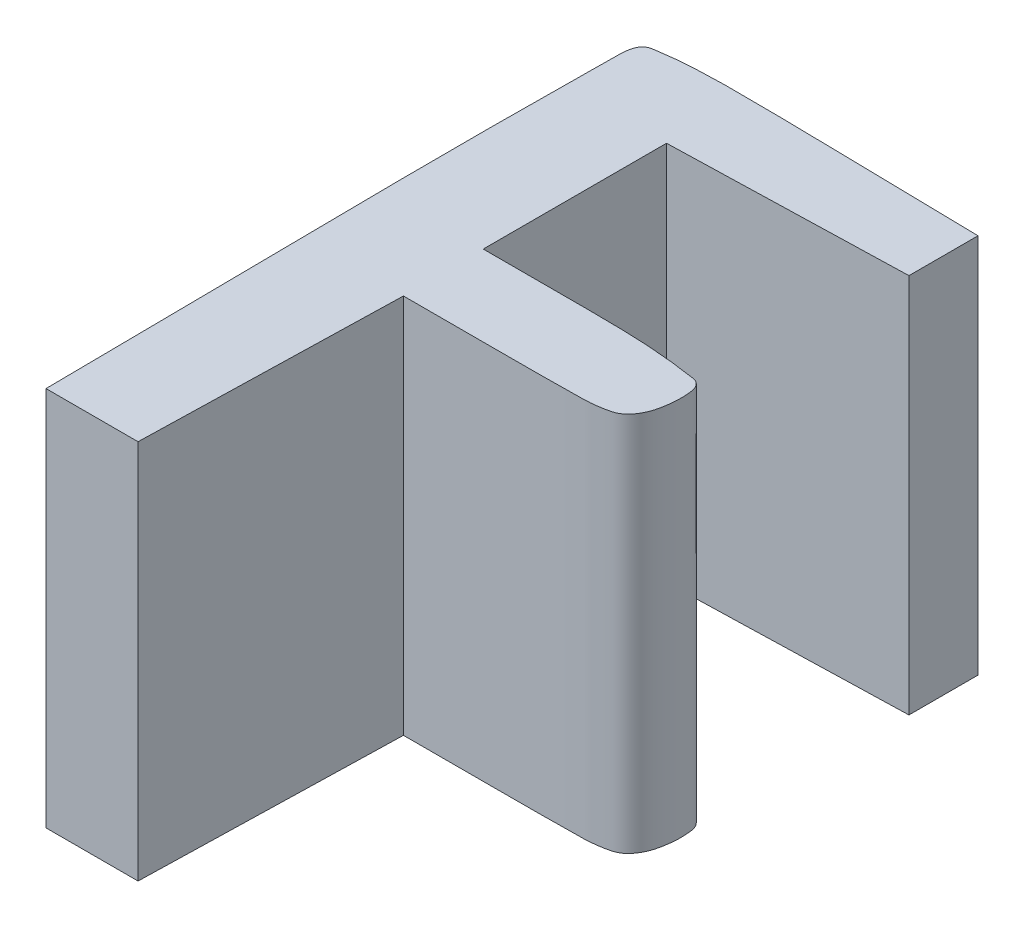
ISO-10303-21;
HEADER;
FILE_DESCRIPTION(('STEP AP214'),'2;1');
FILE_NAME('part.step','',(''),(''),'','','');
FILE_SCHEMA(('AUTOMOTIVE_DESIGN { 1 0 10303 214 1 1 1 1 }'));
ENDSEC;
DATA;
#1=APPLICATION_CONTEXT('core data for automotive mechanical design processes');
#2=APPLICATION_PROTOCOL_DEFINITION('international standard','automotive_design',2000,#1);
#3=PRODUCT_CONTEXT('',#1,'mechanical');
#4=PRODUCT('Part','Part','',(#3));
#5=PRODUCT_RELATED_PRODUCT_CATEGORY('part','',(#4));
#6=PRODUCT_DEFINITION_FORMATION('','',#4);
#7=PRODUCT_DEFINITION_CONTEXT('part definition',#1,'design');
#8=PRODUCT_DEFINITION('design','',#6,#7);
#9=PRODUCT_DEFINITION_SHAPE('','',#8);
#10=(LENGTH_UNIT() NAMED_UNIT(*) SI_UNIT(.MILLI.,.METRE.));
#11=(NAMED_UNIT(*) PLANE_ANGLE_UNIT() SI_UNIT($,.RADIAN.));
#12=(NAMED_UNIT(*) SI_UNIT($,.STERADIAN.) SOLID_ANGLE_UNIT());
#13=UNCERTAINTY_MEASURE_WITH_UNIT(LENGTH_MEASURE(1.E-05),#10,'distance_accuracy_value','');
#14=(GEOMETRIC_REPRESENTATION_CONTEXT(3) GLOBAL_UNCERTAINTY_ASSIGNED_CONTEXT((#13)) GLOBAL_UNIT_ASSIGNED_CONTEXT((#10,
#11,#12)) REPRESENTATION_CONTEXT('',''));
#15=CARTESIAN_POINT('',(0.,0.,0.));
#16=DIRECTION('',(0.,0.,1.));
#17=DIRECTION('',(1.,0.,0.));
#18=AXIS2_PLACEMENT_3D('',#15,#16,#17);
#19=CARTESIAN_POINT('',(51.373291634617,66.7433443998356,55.3705816043237));
#20=DIRECTION('',(0.,1.,0.));
#21=DIRECTION('',(1.,0.,0.));
#22=AXIS2_PLACEMENT_3D('',#19,#20,#21);
#23=PLANE('',#22);
#24=CARTESIAN_POINT('',(51.3971717335317,66.7433443998356,54.6579344724633));
#25=CARTESIAN_POINT('',(51.3971717335317,66.7433443998356,54.6911984724635));
#26=CARTESIAN_POINT('',(51.3971717335317,66.7433443998356,54.7244624724638));
#27=CARTESIAN_POINT('',(51.3971717335317,66.7433443998356,54.7577264724641));
#28=(BOUNDED_CURVE() B_SPLINE_CURVE(3,(#24,#25,#26,#27),.UNSPECIFIED.,.F.,
.F.) B_SPLINE_CURVE_WITH_KNOTS((4,4),(0.,1.),
.UNSPECIFIED.) CURVE() GEOMETRIC_REPRESENTATION_ITEM() RATIONAL_B_SPLINE_CURVE((1.,1.,1.,1.)) REPRESENTATION_ITEM(''));
#29=CARTESIAN_POINT('',(51.3971717335317,66.7433443998356,54.6579344724633));
#30=VERTEX_POINT('',#29);
#31=CARTESIAN_POINT('',(51.3971717335317,66.7433443998356,54.7577264724641));
#32=VERTEX_POINT('',#31);
#33=EDGE_CURVE('E11',#30,#32,#28,.T.);
#34=ORIENTED_EDGE('',*,*,#33,.T.);
#35=CARTESIAN_POINT('',(51.3971717335317,66.7433443998356,54.7577264724641));
#36=CARTESIAN_POINT('',(51.2835197335317,66.7433443998356,54.7608863639676));
#37=CARTESIAN_POINT('',(51.1698677335317,66.7433443998356,54.7640462554712));
#38=CARTESIAN_POINT('',(50.9425637335317,66.7433443998356,54.7703660384783));
#39=CARTESIAN_POINT('',(50.8289117335316,66.7433443998356,54.7735259299832));
#40=CARTESIAN_POINT('',(50.7152597335316,66.7433443998356,54.7766858214872));
#41=(BOUNDED_CURVE() B_SPLINE_CURVE(3,(#35,#36,#37,#38,#39,#40),.UNSPECIFIED.,.F.,
.F.) B_SPLINE_CURVE_WITH_KNOTS((4,2,4),(0.,0.5,1.),
.UNSPECIFIED.) CURVE() GEOMETRIC_REPRESENTATION_ITEM() RATIONAL_B_SPLINE_CURVE((1.,1.,1.,1.,1.,1.)) REPRESENTATION_ITEM(''));
#42=CARTESIAN_POINT('',(50.7152597335316,66.7433443998356,54.7766858214872));
#43=VERTEX_POINT('',#42);
#44=EDGE_CURVE('E196',#32,#43,#41,.T.);
#45=ORIENTED_EDGE('',*,*,#44,.T.);
#46=CARTESIAN_POINT('',(50.7152597335316,66.7433443998356,54.7766858214872));
#47=CARTESIAN_POINT('',(50.7152597335316,66.7433443998356,54.8650019299832));
#48=CARTESIAN_POINT('',(50.7152597335316,66.7433443998356,54.9533180384793));
#49=CARTESIAN_POINT('',(50.7152597335316,66.7433443998356,55.1299502554713));
#50=CARTESIAN_POINT('',(50.7152597335316,66.7433443998356,55.2182663639675));
#51=CARTESIAN_POINT('',(50.7152597335316,66.7433443998356,55.3065824724636));
#52=(BOUNDED_CURVE() B_SPLINE_CURVE(3,(#46,#47,#48,#49,#50,#51),.UNSPECIFIED.,.F.,
.F.) B_SPLINE_CURVE_WITH_KNOTS((4,2,4),(0.,0.5,1.),
.UNSPECIFIED.) CURVE() GEOMETRIC_REPRESENTATION_ITEM() RATIONAL_B_SPLINE_CURVE((1.,1.,1.,1.,1.,1.)) REPRESENTATION_ITEM(''));
#53=CARTESIAN_POINT('',(50.7152597335316,66.7433443998356,55.3065824724636));
#54=VERTEX_POINT('',#53);
#55=EDGE_CURVE('E217',#43,#54,#52,.T.);
#56=ORIENTED_EDGE('',*,*,#55,.T.);
#57=CARTESIAN_POINT('',(50.7152597335316,66.7433443998356,55.3065824724636));
#58=CARTESIAN_POINT('',(50.8199413530359,66.7433443998356,55.3065824724636));
#59=CARTESIAN_POINT('',(50.9246229725397,66.7433443998356,55.3065824724636));
#60=CARTESIAN_POINT('',(51.0293045920445,66.7433443998356,55.3065824724636));
#61=CARTESIAN_POINT('',(51.071874210531,66.7433443998355,55.3065824724631));
#62=CARTESIAN_POINT('',(51.1144363752432,66.7433443998355,55.3073790711196));
#63=CARTESIAN_POINT('',(51.1569761816284,66.7433443998356,55.3089719586388));
#64=CARTESIAN_POINT('',(51.1919522870094,66.7433443998355,55.3102816261352));
#65=CARTESIAN_POINT('',(51.2268650375715,66.7433443998355,55.3127601461486));
#66=CARTESIAN_POINT('',(51.2616753867008,66.7433443998356,55.3164046996459));
#67=CARTESIAN_POINT('',(51.2888790146875,66.7433443998356,55.3192528491184));
#68=CARTESIAN_POINT('',(51.3159992394937,66.7433443998356,55.3228085178742));
#69=CARTESIAN_POINT('',(51.3430176754193,66.7433443998356,55.3270692045752));
#70=CARTESIAN_POINT('',(51.3523045680939,66.7433443998355,55.3285337060818));
#71=CARTESIAN_POINT('',(51.3601334096972,66.7433443998355,55.3337395127712));
#72=CARTESIAN_POINT('',(51.365076164797,66.7433443998356,55.341737031902));
#73=CARTESIAN_POINT('',(51.3686822379329,66.7433443998357,55.3475717613819));
#74=CARTESIAN_POINT('',(51.371040641636,66.7433443998357,55.3540127080559));
#75=CARTESIAN_POINT('',(51.3720549519967,66.7433443998356,55.3607964390394));
#76=CARTESIAN_POINT('',(51.3735230221042,66.7433443998356,55.3706149256329));
#77=CARTESIAN_POINT('',(51.3743156046407,66.7433443998356,55.3805108700789));
#78=CARTESIAN_POINT('',(51.3744289704119,66.7433443998356,55.390437856382));
#79=CARTESIAN_POINT('',(51.3745588689021,66.7433443998356,55.4018125466901));
#80=CARTESIAN_POINT('',(51.3739514133887,66.7433443998356,55.4131717501605));
#81=CARTESIAN_POINT('',(51.3726092632913,66.7433443998356,55.4244677267196));
#82=CARTESIAN_POINT('',(51.371260036689,66.7433443998356,55.4358232614782));
#83=CARTESIAN_POINT('',(51.3691893158798,66.7433443998356,55.4470696258412));
#84=CARTESIAN_POINT('',(51.3664055605567,66.7433443998356,55.4581610319037));
#85=CARTESIAN_POINT('',(51.36213651395,66.7433443998355,55.4751703319016));
#86=CARTESIAN_POINT('',(51.3543697520201,66.7433443998355,55.490893512504));
#87=CARTESIAN_POINT('',(51.3434559951478,66.7433443998356,55.5046205280651));
#88=CARTESIAN_POINT('',(51.3339429085179,66.7433443998355,55.5165858201013));
#89=CARTESIAN_POINT('',(51.3210622987298,66.7433443998355,55.5248172858482));
#90=CARTESIAN_POINT('',(51.3062077995474,66.7433443998356,55.5284243462556));
#91=CARTESIAN_POINT('',(51.2822652175274,66.7433443998356,55.5342382305606));
#92=CARTESIAN_POINT('',(51.2578263407489,66.7433443998356,55.5373671074396));
#93=CARTESIAN_POINT('',(51.2331913237085,66.7433443998356,55.5377725947036));
#94=CARTESIAN_POINT('',(51.1660406613167,66.7433443998356,55.5388778806603));
#95=CARTESIAN_POINT('',(51.0988831752327,66.7433443998356,55.539430415209));
#96=CARTESIAN_POINT('',(51.031723417067,66.7433443998356,55.5394304724649));
#97=CARTESIAN_POINT('',(50.9269618087316,66.7433443998356,55.5394305617775));
#98=CARTESIAN_POINT('',(50.8222002003962,66.7433443998356,55.5394304724649));
#99=CARTESIAN_POINT('',(50.7174385920608,66.7433443998356,55.5394304724649));
#100=(BOUNDED_CURVE() B_SPLINE_CURVE(3,(#57,#58,#59,#60,#61,#62,#63,#64,#65,#66,#67,#68,#69,#70,
#71,#72,#73,#74,#75,#76,#77,#78,#79,#80,#81,#82,#83,#84,#85,#86,#87,#88,#89,#90,#91,#92,#93,#94,
#95,#96,#97,#98,#99),.UNSPECIFIED.,.F.,.F.) B_SPLINE_CURVE_WITH_KNOTS((4,3,3,3,3,3,3,3,3,3,3,3,
3,3,4),(0.,0.229788864787456,0.323223438301511,0.400016433007099,0.460015134340688,
0.479384216016555,0.493322627749221,0.513464955623741,0.536512411697456,0.559649940481591,
0.594598532799686,0.623963174611789,0.671099542362412,0.799581973865831,1.),
.UNSPECIFIED.) CURVE() GEOMETRIC_REPRESENTATION_ITEM() RATIONAL_B_SPLINE_CURVE((1.,1.,1.,1.,
0.999883272287915,0.999883272287915,1.,0.999627181373122,0.999627181373122,1.,0.999773906973047,
0.999773906973047,1.,0.939197565396283,0.939197565396283,1.,0.986367651811576,0.986367651811576,
1.,0.998436473352878,0.998436473352878,1.,0.998599113728503,0.998599113728503,1.,
0.998642782615651,0.998642782615651,1.,0.98494704131299,0.98494704131299,1.,0.963935207794576,
0.963935207794576,1.,0.995906200088299,0.995906200088299,1.,0.999977433720601,0.999977433720601,
1.,1.,1.,1.)) REPRESENTATION_ITEM(''));
#101=CARTESIAN_POINT('',(50.7174385920608,66.7433443998356,55.5394304724649));
#102=VERTEX_POINT('',#101);
#103=EDGE_CURVE('E124',#54,#102,#100,.T.);
#104=ORIENTED_EDGE('',*,*,#103,.T.);
#105=CARTESIAN_POINT('',(50.7174385920608,66.7433443998356,55.5394304724649));
#106=CARTESIAN_POINT('',(50.7143034489725,66.7433443998356,55.6641704724642));
#107=CARTESIAN_POINT('',(50.7111683058847,66.7433443998356,55.7889104724635));
#108=CARTESIAN_POINT('',(50.7048980197087,66.7433443998356,56.0383904724628));
#109=CARTESIAN_POINT('',(50.7017628766191,66.7433443998356,56.1631304724625));
#110=CARTESIAN_POINT('',(50.6986277335308,66.7433443998356,56.2878704724625));
#111=(BOUNDED_CURVE() B_SPLINE_CURVE(3,(#105,#106,#107,#108,#109,#110),.UNSPECIFIED.,.F.,
.F.) B_SPLINE_CURVE_WITH_KNOTS((4,2,4),(0.,0.5,1.),
.UNSPECIFIED.) CURVE() GEOMETRIC_REPRESENTATION_ITEM() RATIONAL_B_SPLINE_CURVE((1.,1.,1.,1.,1.,1.)) REPRESENTATION_ITEM(''));
#112=CARTESIAN_POINT('',(50.6986277335308,66.7433443998356,56.2878704724625));
#113=VERTEX_POINT('',#112);
#114=EDGE_CURVE('E96',#102,#113,#111,.T.);
#115=ORIENTED_EDGE('',*,*,#114,.T.);
#116=CARTESIAN_POINT('',(50.6986277335308,66.7433443998356,56.2878704724625));
#117=CARTESIAN_POINT('',(50.6542757335315,66.7433443998356,56.2878704724625));
#118=CARTESIAN_POINT('',(50.6099237335313,66.7433443998356,56.2878704724625));
#119=CARTESIAN_POINT('',(50.5212197335318,66.7433443998356,56.2878704724625));
#120=CARTESIAN_POINT('',(50.4768677335317,66.7433443998356,56.2878704724625));
#121=CARTESIAN_POINT('',(50.4325157335315,66.7433443998356,56.2878704724625));
#122=(BOUNDED_CURVE() B_SPLINE_CURVE(3,(#116,#117,#118,#119,#120,#121),.UNSPECIFIED.,.F.,
.F.) B_SPLINE_CURVE_WITH_KNOTS((4,2,4),(0.,0.5,1.),
.UNSPECIFIED.) CURVE() GEOMETRIC_REPRESENTATION_ITEM() RATIONAL_B_SPLINE_CURVE((1.,1.,1.,1.,1.,1.)) REPRESENTATION_ITEM(''));
#123=CARTESIAN_POINT('',(50.4325157335315,66.7433443998356,56.2878704724625));
#124=VERTEX_POINT('',#123);
#125=EDGE_CURVE('E147',#113,#124,#122,.T.);
#126=ORIENTED_EDGE('',*,*,#125,.T.);
#127=CARTESIAN_POINT('',(50.4325157335315,66.7433443998356,56.2878704724625));
#128=CARTESIAN_POINT('',(50.4295444156437,66.7433443998356,56.0108704667188));
#129=CARTESIAN_POINT('',(50.4265730977564,66.7433443998356,55.7338704609748));
#130=CARTESIAN_POINT('',(50.4236017798683,66.7433443998356,55.4568704552311));
#131=CARTESIAN_POINT('',(50.4224518407516,66.7433443998356,55.349667808439));
#132=CARTESIAN_POINT('',(50.4217114344264,66.7433443998356,55.2424615513401));
#133=CARTESIAN_POINT('',(50.4213808756428,66.7433443998356,55.1352532467026));
#134=CARTESIAN_POINT('',(50.4210952157354,66.7433443998355,55.0426067468045));
#135=CARTESIAN_POINT('',(50.4213562078942,66.7433443998355,54.9499601751488));
#136=CARTESIAN_POINT('',(50.4221643426372,66.7433443998356,54.8573167595678));
#137=CARTESIAN_POINT('',(50.4228638968235,66.7433443998357,54.7771208643304));
#138=CARTESIAN_POINT('',(50.4237138219498,66.7433443998357,54.6969264218442));
#139=CARTESIAN_POINT('',(50.4247142278198,66.7433443998356,54.6167337153273));
#140=CARTESIAN_POINT('',(50.4248595225826,66.7433443998356,54.6050868621295));
#141=CARTESIAN_POINT('',(50.4270529147217,66.7433443998356,54.5936474855717));
#142=CARTESIAN_POINT('',(50.4312258886677,66.7433443998356,54.5827729010543));
#143=CARTESIAN_POINT('',(50.4357041834794,66.7433443998356,54.5711026639386));
#144=CARTESIAN_POINT('',(50.4453772564852,66.7433443998356,54.5631855212453));
#145=CARTESIAN_POINT('',(50.4577024692583,66.7433443998356,54.5611025692944));
#146=CARTESIAN_POINT('',(50.4865641426252,66.7433443998356,54.5562249675885));
#147=CARTESIAN_POINT('',(50.5156311004583,66.7433443998356,54.5527754578711));
#148=CARTESIAN_POINT('',(50.5448327272442,66.7433443998356,54.5507624548955));
#149=CARTESIAN_POINT('',(50.5912468835444,66.7433443998355,54.54756291278));
#150=CARTESIAN_POINT('',(50.637746246506,66.7433443998355,54.5460397300226));
#151=CARTESIAN_POINT('',(50.6842702925858,66.7433443998356,54.546195008319));
#152=CARTESIAN_POINT('',(50.7636759047845,66.7433443998355,54.5464600318762));
#153=CARTESIAN_POINT('',(50.8430768057844,66.7433443998355,54.547364670312));
#154=CARTESIAN_POINT('',(50.9224678423308,66.7433443998356,54.5489089515504));
#155=CARTESIAN_POINT('',(51.0807024713007,66.7433443998356,54.5519868653731));
#156=CARTESIAN_POINT('',(51.2389371031314,66.7433443998356,54.5550646321597));
#157=CARTESIAN_POINT('',(51.3971717335317,66.7433443998356,54.5581424724641));
#158=(BOUNDED_CURVE() B_SPLINE_CURVE(3,(#127,#128,#129,#130,#131,#132,#133,#134,#135,#136,#137,
#138,#139,#140,#141,#142,#143,#144,#145,#146,#147,#148,#149,#150,#151,#152,#153,#154,#155,#156,
#157),.UNSPECIFIED.,.F.,.F.) B_SPLINE_CURVE_WITH_KNOTS((4,3,3,3,3,3,3,3,3,3,4),(0.,
0.321158741309344,0.445450794567691,0.552859357210903,0.645836453082566,0.659199459911331,
0.672283658884566,0.702897819618335,0.751535995640272,0.834548134954547,1.),
.UNSPECIFIED.) CURVE() GEOMETRIC_REPRESENTATION_ITEM() RATIONAL_B_SPLINE_CURVE((1.,1.,1.,1.,
0.999995130789782,0.999995130789782,1.,0.999988381029251,0.999988381029251,1.,0.999998826875699,
0.999998826875699,1.,0.989588143335317,0.989588143335317,1.,0.912380390140398,0.912380390140398,
1.,0.999190131668668,0.999190131668668,1.,0.999566074798948,0.999566074798948,1.,
0.999978367305653,0.999978367305653,1.,1.,1.,1.)) REPRESENTATION_ITEM(''));
#159=CARTESIAN_POINT('',(51.3971717335317,66.7433443998356,54.5581424724641));
#160=VERTEX_POINT('',#159);
#161=EDGE_CURVE('E70',#124,#160,#158,.T.);
#162=ORIENTED_EDGE('',*,*,#161,.T.);
#163=CARTESIAN_POINT('',(51.3971717335317,66.7433443998356,54.5581424724641));
#164=CARTESIAN_POINT('',(51.3971717335317,66.7433443998356,54.5914064724639));
#165=CARTESIAN_POINT('',(51.3971717335317,66.7433443998356,54.6246704724635));
#166=CARTESIAN_POINT('',(51.3971717335317,66.7433443998356,54.6579344724633));
#167=(BOUNDED_CURVE() B_SPLINE_CURVE(3,(#163,#164,#165,#166),.UNSPECIFIED.,.F.,
.F.) B_SPLINE_CURVE_WITH_KNOTS((4,4),(0.,1.),
.UNSPECIFIED.) CURVE() GEOMETRIC_REPRESENTATION_ITEM() RATIONAL_B_SPLINE_CURVE((1.,1.,1.,1.)) REPRESENTATION_ITEM(''));
#168=EDGE_CURVE('E168',#160,#30,#167,.T.);
#169=ORIENTED_EDGE('',*,*,#168,.T.);
#170=EDGE_LOOP('',(#34,#45,#56,#104,#115,#126,#162,#169));
#171=FACE_BOUND('',#170,.T.);
#172=ADVANCED_FACE('F16',(#171),#23,.F.);
#173=CARTESIAN_POINT('',(51.373291634617,67.8433443998356,55.3705816043237));
#174=DIRECTION('',(0.,1.,0.));
#175=DIRECTION('',(1.,0.,0.));
#176=AXIS2_PLACEMENT_3D('',#173,#174,#175);
#177=PLANE('',#176);
#178=DIRECTION('',(-0.999613714432557,0.,0.0277924795285686));
#179=VECTOR('',#178,1.);
#180=CARTESIAN_POINT('',(51.3971717335317,67.8433443998356,54.7577264724641));
#181=LINE('',#180,#179);
#182=CARTESIAN_POINT('',(51.3971717335317,67.8433443998356,54.7577264724641));
#183=VERTEX_POINT('',#182);
#184=CARTESIAN_POINT('',(50.7152597335316,67.8433443998356,54.7766858214872));
#185=VERTEX_POINT('',#184);
#186=EDGE_CURVE('E186',#183,#185,#181,.T.);
#187=ORIENTED_EDGE('',*,*,#186,.F.);
#188=DIRECTION('',(0.,0.,1.));
#189=VECTOR('',#188,1.);
#190=CARTESIAN_POINT('',(51.3971717335317,67.8433443998356,54.5581424724641));
#191=LINE('',#190,#189);
#192=CARTESIAN_POINT('',(51.3971717335317,67.8433443998356,54.5581424724641));
#193=VERTEX_POINT('',#192);
#194=EDGE_CURVE('E27',#193,#183,#191,.T.);
#195=ORIENTED_EDGE('',*,*,#194,.F.);
#196=CARTESIAN_POINT('',(50.4325157335315,67.8433443998356,56.2878704724625));
#197=CARTESIAN_POINT('',(50.4295444156437,67.8433443998357,56.0108704667188));
#198=CARTESIAN_POINT('',(50.4265730977564,67.8433443998357,55.7338704609748));
#199=CARTESIAN_POINT('',(50.4236017798683,67.8433443998357,55.4568704552311));
#200=CARTESIAN_POINT('',(50.4224518407516,67.8433443998356,55.349667808439));
#201=CARTESIAN_POINT('',(50.4217114344264,67.8433443998356,55.2424615513401));
#202=CARTESIAN_POINT('',(50.4213808756428,67.8433443998357,55.1352532467026));
#203=CARTESIAN_POINT('',(50.4210952157354,67.8433443998357,55.0426067468045));
#204=CARTESIAN_POINT('',(50.4213562078942,67.8433443998357,54.9499601751488));
#205=CARTESIAN_POINT('',(50.4221643426372,67.8433443998357,54.8573167595678));
#206=CARTESIAN_POINT('',(50.4228638968235,67.8433443998358,54.7771208643304));
#207=CARTESIAN_POINT('',(50.4237138219498,67.8433443998358,54.6969264218442));
#208=CARTESIAN_POINT('',(50.4247142278198,67.8433443998357,54.6167337153273));
#209=CARTESIAN_POINT('',(50.4248595225826,67.8433443998357,54.6050868621295));
#210=CARTESIAN_POINT('',(50.4270529147217,67.8433443998357,54.5936474855717));
#211=CARTESIAN_POINT('',(50.4312258886677,67.8433443998357,54.5827729010543));
#212=CARTESIAN_POINT('',(50.4357041834794,67.8433443998356,54.5711026639386));
#213=CARTESIAN_POINT('',(50.4453772564852,67.8433443998356,54.5631855212453));
#214=CARTESIAN_POINT('',(50.4577024692583,67.8433443998357,54.5611025692944));
#215=CARTESIAN_POINT('',(50.4865641426252,67.8433443998358,54.5562249675886));
#216=CARTESIAN_POINT('',(50.5156311004583,67.8433443998358,54.5527754578711));
#217=CARTESIAN_POINT('',(50.5448327272442,67.8433443998357,54.5507624548955));
#218=CARTESIAN_POINT('',(50.5912468835444,67.8433443998357,54.54756291278));
#219=CARTESIAN_POINT('',(50.637746246506,67.8433443998357,54.5460397300226));
#220=CARTESIAN_POINT('',(50.6842702925858,67.8433443998357,54.546195008319));
#221=CARTESIAN_POINT('',(50.7636759047845,67.8433443998357,54.5464600318762));
#222=CARTESIAN_POINT('',(50.8430768057844,67.8433443998357,54.547364670312));
#223=CARTESIAN_POINT('',(50.9224678423308,67.8433443998357,54.5489089515504));
#224=CARTESIAN_POINT('',(51.0807024713007,67.8433443998357,54.5519868653731));
#225=CARTESIAN_POINT('',(51.2389371031314,67.8433443998357,54.5550646321597));
#226=CARTESIAN_POINT('',(51.3971717335317,67.8433443998356,54.5581424724641));
#227=(BOUNDED_CURVE() B_SPLINE_CURVE(3,(#196,#197,#198,#199,#200,#201,#202,#203,#204,#205,#206,
#207,#208,#209,#210,#211,#212,#213,#214,#215,#216,#217,#218,#219,#220,#221,#222,#223,#224,#225,
#226),.UNSPECIFIED.,.F.,.F.) B_SPLINE_CURVE_WITH_KNOTS((4,3,3,3,3,3,3,3,3,3,4),(0.,
0.321158741309344,0.445450794567691,0.552859357210903,0.645836453082566,0.659199459911331,
0.672283658884566,0.702897819618335,0.751535995640272,0.834548134954547,1.),
.UNSPECIFIED.) CURVE() GEOMETRIC_REPRESENTATION_ITEM() RATIONAL_B_SPLINE_CURVE((1.,1.,1.,1.,
0.999995130789782,0.999995130789782,1.,0.999988381029251,0.999988381029251,1.,0.999998826875699,
0.999998826875699,1.,0.989588143335317,0.989588143335317,1.,0.912380390140398,0.912380390140398,
1.,0.999190131668668,0.999190131668668,1.,0.999566074798948,0.999566074798948,1.,
0.999978367305653,0.999978367305653,1.,1.,1.,1.)) REPRESENTATION_ITEM(''));
#228=CARTESIAN_POINT('',(50.4325157335315,67.8433443998356,56.2878704724625));
#229=VERTEX_POINT('',#228);
#230=EDGE_CURVE('E57',#229,#193,#227,.T.);
#231=ORIENTED_EDGE('',*,*,#230,.F.);
#232=DIRECTION('',(-1.,0.,0.));
#233=VECTOR('',#232,1.);
#234=CARTESIAN_POINT('',(50.6986277335308,67.8433443998356,56.2878704724625));
#235=LINE('',#234,#233);
#236=CARTESIAN_POINT('',(50.6986277335308,67.8433443998356,56.2878704724625));
#237=VERTEX_POINT('',#236);
#238=EDGE_CURVE('E108',#237,#229,#235,.T.);
#239=ORIENTED_EDGE('',*,*,#238,.F.);
#240=DIRECTION('',(-0.0251254877317318,0.,0.999684305101487));
#241=VECTOR('',#240,1.);
#242=CARTESIAN_POINT('',(50.7174385920608,67.8433443998356,55.5394304724649));
#243=LINE('',#242,#241);
#244=CARTESIAN_POINT('',(50.7174385920608,67.8433443998356,55.5394304724649));
#245=VERTEX_POINT('',#244);
#246=EDGE_CURVE('E101',#245,#237,#243,.T.);
#247=ORIENTED_EDGE('',*,*,#246,.F.);
#248=CARTESIAN_POINT('',(50.7152597335316,67.8433443998356,55.3065824724636));
#249=CARTESIAN_POINT('',(50.8199413530359,67.8433443998357,55.3065824724636));
#250=CARTESIAN_POINT('',(50.9246229725397,67.8433443998357,55.3065824724636));
#251=CARTESIAN_POINT('',(51.0293045920445,67.8433443998357,55.3065824724636));
#252=CARTESIAN_POINT('',(51.071874210531,67.8433443998356,55.3065824724631));
#253=CARTESIAN_POINT('',(51.1144363752432,67.8433443998356,55.3073790711196));
#254=CARTESIAN_POINT('',(51.1569761816284,67.8433443998357,55.3089719586388));
#255=CARTESIAN_POINT('',(51.1919522870094,67.8433443998357,55.3102816261352));
#256=CARTESIAN_POINT('',(51.2268650375715,67.8433443998357,55.3127601461486));
#257=CARTESIAN_POINT('',(51.2616753867008,67.8433443998357,55.3164046996459));
#258=CARTESIAN_POINT('',(51.2888790146875,67.8433443998356,55.3192528491184));
#259=CARTESIAN_POINT('',(51.3159992394937,67.8433443998356,55.3228085178742));
#260=CARTESIAN_POINT('',(51.3430176754193,67.8433443998357,55.3270692045752));
#261=CARTESIAN_POINT('',(51.3523045680939,67.8433443998356,55.3285337060818));
#262=CARTESIAN_POINT('',(51.3601334096972,67.8433443998356,55.3337395127712));
#263=CARTESIAN_POINT('',(51.365076164797,67.8433443998357,55.341737031902));
#264=CARTESIAN_POINT('',(51.3686822379329,67.8433443998355,55.3475717613819));
#265=CARTESIAN_POINT('',(51.371040641636,67.8433443998355,55.3540127080559));
#266=CARTESIAN_POINT('',(51.3720549519967,67.8433443998357,55.3607964390394));
#267=CARTESIAN_POINT('',(51.3735230221042,67.8433443998357,55.3706149256329));
#268=CARTESIAN_POINT('',(51.3743156046407,67.8433443998357,55.3805108700789));
#269=CARTESIAN_POINT('',(51.3744289704119,67.8433443998357,55.390437856382));
#270=CARTESIAN_POINT('',(51.3745588689021,67.8433443998357,55.4018125466901));
#271=CARTESIAN_POINT('',(51.3739514133887,67.8433443998357,55.4131717501605));
#272=CARTESIAN_POINT('',(51.3726092632913,67.8433443998357,55.4244677267196));
#273=CARTESIAN_POINT('',(51.371260036689,67.8433443998356,55.4358232614782));
#274=CARTESIAN_POINT('',(51.3691893158798,67.8433443998356,55.4470696258412));
#275=CARTESIAN_POINT('',(51.3664055605567,67.8433443998357,55.4581610319037));
#276=CARTESIAN_POINT('',(51.36213651395,67.8433443998356,55.4751703319016));
#277=CARTESIAN_POINT('',(51.3543697520201,67.8433443998356,55.490893512504));
#278=CARTESIAN_POINT('',(51.3434559951478,67.8433443998357,55.5046205280651));
#279=CARTESIAN_POINT('',(51.3339429085179,67.8433443998357,55.5165858201013));
#280=CARTESIAN_POINT('',(51.3210622987298,67.8433443998357,55.5248172858482));
#281=CARTESIAN_POINT('',(51.3062077995474,67.8433443998357,55.5284243462556));
#282=CARTESIAN_POINT('',(51.2822652175274,67.8433443998356,55.5342382305606));
#283=CARTESIAN_POINT('',(51.2578263407489,67.8433443998356,55.5373671074396));
#284=CARTESIAN_POINT('',(51.2331913237085,67.8433443998357,55.5377725947036));
#285=CARTESIAN_POINT('',(51.1660406613167,67.8433443998357,55.5388778806603));
#286=CARTESIAN_POINT('',(51.0988831752327,67.8433443998357,55.539430415209));
#287=CARTESIAN_POINT('',(51.031723417067,67.8433443998357,55.5394304724649));
#288=CARTESIAN_POINT('',(50.9269618087316,67.8433443998357,55.5394305617775));
#289=CARTESIAN_POINT('',(50.8222002003962,67.8433443998357,55.5394304724649));
#290=CARTESIAN_POINT('',(50.7174385920608,67.8433443998356,55.5394304724649));
#291=(BOUNDED_CURVE() B_SPLINE_CURVE(3,(#248,#249,#250,#251,#252,#253,#254,#255,#256,#257,#258,
#259,#260,#261,#262,#263,#264,#265,#266,#267,#268,#269,#270,#271,#272,#273,#274,#275,#276,#277,
#278,#279,#280,#281,#282,#283,#284,#285,#286,#287,#288,#289,#290),.UNSPECIFIED.,.F.,
.F.) B_SPLINE_CURVE_WITH_KNOTS((4,3,3,3,3,3,3,3,3,3,3,3,3,3,4),(0.,0.229788864787456,
0.323223438301511,0.400016433007099,0.460015134340688,0.479384216016555,0.493322627749221,
0.513464955623741,0.536512411697456,0.559649940481591,0.594598532799686,0.623963174611789,
0.671099542362412,0.799581973865831,1.),
.UNSPECIFIED.) CURVE() GEOMETRIC_REPRESENTATION_ITEM() RATIONAL_B_SPLINE_CURVE((1.,1.,1.,1.,
0.999883272287915,0.999883272287915,1.,0.999627181373122,0.999627181373122,1.,0.999773906973047,
0.999773906973047,1.,0.939197565396283,0.939197565396283,1.,0.986367651811576,0.986367651811576,
1.,0.998436473352878,0.998436473352878,1.,0.998599113728503,0.998599113728503,1.,
0.998642782615651,0.998642782615651,1.,0.98494704131299,0.98494704131299,1.,0.963935207794576,
0.963935207794576,1.,0.995906200088299,0.995906200088299,1.,0.999977433720601,0.999977433720601,
1.,1.,1.,1.)) REPRESENTATION_ITEM(''));
#292=CARTESIAN_POINT('',(50.7152597335316,67.8433443998356,55.3065824724636));
#293=VERTEX_POINT('',#292);
#294=EDGE_CURVE('E105',#293,#245,#291,.T.);
#295=ORIENTED_EDGE('',*,*,#294,.F.);
#296=DIRECTION('',(0.,0.,1.));
#297=VECTOR('',#296,1.);
#298=CARTESIAN_POINT('',(50.7152597335316,67.8433443998356,54.7766858214872));
#299=LINE('',#298,#297);
#300=EDGE_CURVE('E187',#185,#293,#299,.T.);
#301=ORIENTED_EDGE('',*,*,#300,.F.);
#302=EDGE_LOOP('',(#187,#195,#231,#239,#247,#295,#301));
#303=FACE_BOUND('',#302,.T.);
#304=ADVANCED_FACE('F103',(#303),#177,.T.);
#305=CARTESIAN_POINT('',(51.3971717335317,67.7433443998356,54.5581424724641));
#306=DIRECTION('',(1.,0.,0.));
#307=DIRECTION('',(0.,1.,0.));
#308=AXIS2_PLACEMENT_3D('',#305,#306,#307);
#309=PLANE('',#308);
#310=ORIENTED_EDGE('',*,*,#168,.F.);
#311=DIRECTION('',(0.,-1.,0.));
#312=VECTOR('',#311,1.);
#313=CARTESIAN_POINT('',(51.3971717335317,67.7433443998356,54.5581424724641));
#314=LINE('',#313,#312);
#315=EDGE_CURVE('E162',#193,#160,#314,.T.);
#316=ORIENTED_EDGE('',*,*,#315,.F.);
#317=ORIENTED_EDGE('',*,*,#194,.T.);
#318=DIRECTION('',(0.,-1.,0.));
#319=VECTOR('',#318,1.);
#320=CARTESIAN_POINT('',(51.3971717335317,67.7433443998356,54.7577264724641));
#321=LINE('',#320,#319);
#322=EDGE_CURVE('E182',#183,#32,#321,.T.);
#323=ORIENTED_EDGE('',*,*,#322,.T.);
#324=ORIENTED_EDGE('',*,*,#33,.F.);
#325=EDGE_LOOP('',(#310,#316,#317,#323,#324));
#326=FACE_BOUND('',#325,.T.);
#327=ADVANCED_FACE('F179',(#326),#309,.T.);
#328=CARTESIAN_POINT('',(50.4325157335315,67.8433443998357,56.2878704724625));
#329=CARTESIAN_POINT('',(50.4325157335315,66.7433443998356,56.2878704724625));
#330=CARTESIAN_POINT('',(50.4295444156437,67.8433443998357,56.0108704667188));
#331=CARTESIAN_POINT('',(50.4295444156437,66.7433443998356,56.0108704667188));
#332=CARTESIAN_POINT('',(50.4265730977564,67.8433443998357,55.7338704609748));
#333=CARTESIAN_POINT('',(50.4265730977564,66.7433443998356,55.7338704609748));
#334=CARTESIAN_POINT('',(50.4236017798683,67.8433443998357,55.4568704552311));
#335=CARTESIAN_POINT('',(50.4236017798683,66.7433443998356,55.4568704552311));
#336=CARTESIAN_POINT('',(50.4224518407516,67.8433443998356,55.349667808439));
#337=CARTESIAN_POINT('',(50.4224518407516,66.7433443998354,55.349667808439));
#338=CARTESIAN_POINT('',(50.4217114344264,67.8433443998356,55.2424615513401));
#339=CARTESIAN_POINT('',(50.4217114344264,66.7433443998354,55.2424615513401));
#340=CARTESIAN_POINT('',(50.4213808756428,67.8433443998357,55.1352532467026));
#341=CARTESIAN_POINT('',(50.4213808756428,66.7433443998356,55.1352532467026));
#342=CARTESIAN_POINT('',(50.4210952157354,67.8433443998357,55.0426067468045));
#343=CARTESIAN_POINT('',(50.4210952157354,66.7433443998356,55.0426067468045));
#344=CARTESIAN_POINT('',(50.4213562078942,67.8433443998357,54.9499601751488));
#345=CARTESIAN_POINT('',(50.4213562078942,66.7433443998356,54.9499601751488));
#346=CARTESIAN_POINT('',(50.4221643426372,67.8433443998357,54.8573167595678));
#347=CARTESIAN_POINT('',(50.4221643426372,66.7433443998356,54.8573167595678));
#348=CARTESIAN_POINT('',(50.4228638968235,67.8433443998358,54.7771208643304));
#349=CARTESIAN_POINT('',(50.4228638968235,66.7433443998357,54.7771208643304));
#350=CARTESIAN_POINT('',(50.4237138219498,67.8433443998358,54.6969264218442));
#351=CARTESIAN_POINT('',(50.4237138219498,66.7433443998357,54.6969264218442));
#352=CARTESIAN_POINT('',(50.4247142278198,67.8433443998357,54.6167337153273));
#353=CARTESIAN_POINT('',(50.4247142278198,66.7433443998356,54.6167337153273));
#354=CARTESIAN_POINT('',(50.4248595225826,67.8433443998357,54.6050868621295));
#355=CARTESIAN_POINT('',(50.4248595225826,66.7433443998357,54.6050868621295));
#356=CARTESIAN_POINT('',(50.4270529147217,67.8433443998357,54.5936474855717));
#357=CARTESIAN_POINT('',(50.4270529147217,66.7433443998357,54.5936474855717));
#358=CARTESIAN_POINT('',(50.4312258886677,67.8433443998357,54.5827729010543));
#359=CARTESIAN_POINT('',(50.4312258886677,66.7433443998356,54.5827729010543));
#360=CARTESIAN_POINT('',(50.4357041834794,67.8433443998356,54.5711026639386));
#361=CARTESIAN_POINT('',(50.4357041834794,66.7433443998355,54.5711026639386));
#362=CARTESIAN_POINT('',(50.4453772564852,67.8433443998356,54.5631855212453));
#363=CARTESIAN_POINT('',(50.4453772564852,66.7433443998355,54.5631855212453));
#364=CARTESIAN_POINT('',(50.4577024692583,67.8433443998357,54.5611025692944));
#365=CARTESIAN_POINT('',(50.4577024692583,66.7433443998356,54.5611025692944));
#366=CARTESIAN_POINT('',(50.4865641426252,67.8433443998358,54.5562249675886));
#367=CARTESIAN_POINT('',(50.4865641426252,66.7433443998357,54.5562249675886));
#368=CARTESIAN_POINT('',(50.5156311004583,67.8433443998358,54.5527754578711));
#369=CARTESIAN_POINT('',(50.5156311004583,66.7433443998357,54.5527754578711));
#370=CARTESIAN_POINT('',(50.5448327272442,67.8433443998357,54.5507624548955));
#371=CARTESIAN_POINT('',(50.5448327272442,66.7433443998356,54.5507624548955));
#372=CARTESIAN_POINT('',(50.5912468835444,67.8433443998357,54.54756291278));
#373=CARTESIAN_POINT('',(50.5912468835444,66.7433443998356,54.54756291278));
#374=CARTESIAN_POINT('',(50.637746246506,67.8433443998357,54.5460397300226));
#375=CARTESIAN_POINT('',(50.637746246506,66.7433443998356,54.5460397300226));
#376=CARTESIAN_POINT('',(50.6842702925858,67.8433443998357,54.546195008319));
#377=CARTESIAN_POINT('',(50.6842702925858,66.7433443998356,54.546195008319));
#378=CARTESIAN_POINT('',(50.7636759047845,67.8433443998357,54.5464600318762));
#379=CARTESIAN_POINT('',(50.7636759047845,66.7433443998355,54.5464600318762));
#380=CARTESIAN_POINT('',(50.8430768057844,67.8433443998357,54.547364670312));
#381=CARTESIAN_POINT('',(50.8430768057844,66.7433443998355,54.547364670312));
#382=CARTESIAN_POINT('',(50.9224678423308,67.8433443998357,54.5489089515504));
#383=CARTESIAN_POINT('',(50.9224678423308,66.7433443998356,54.5489089515504));
#384=CARTESIAN_POINT('',(51.0807024713007,67.8433443998357,54.5519868653731));
#385=CARTESIAN_POINT('',(51.0807024713007,66.7433443998356,54.5519868653731));
#386=CARTESIAN_POINT('',(51.2389371031314,67.8433443998357,54.5550646321597));
#387=CARTESIAN_POINT('',(51.2389371031314,66.7433443998356,54.5550646321597));
#388=CARTESIAN_POINT('',(51.3971717335317,67.8433443998357,54.5581424724641));
#389=CARTESIAN_POINT('',(51.3971717335317,66.7433443998356,54.5581424724641));
#390=(BOUNDED_SURFACE() B_SPLINE_SURFACE(3,1,((#328,#329),(#330,#331),(#332,#333),(#334,#335),
(#336,#337),(#338,#339),(#340,#341),(#342,#343),(#344,#345),(#346,#347),(#348,#349),(#350,#351),
(#352,#353),(#354,#355),(#356,#357),(#358,#359),(#360,#361),(#362,#363),(#364,#365),(#366,#367),
(#368,#369),(#370,#371),(#372,#373),(#374,#375),(#376,#377),(#378,#379),(#380,#381),(#382,#383),
(#384,#385),(#386,#387),(#388,#389)),.UNSPECIFIED.,.F.,.F.,.F.) B_SPLINE_SURFACE_WITH_KNOTS((4,
3,3,3,3,3,3,3,3,3,4),(2,2),(0.,0.321158741309344,0.445450794567691,0.552859357210903,
0.645836453082566,0.659199459911331,0.672283658884566,0.702897819618335,0.751535995640272,
0.834548134954547,1.),(0.,1.),
.UNSPECIFIED.) GEOMETRIC_REPRESENTATION_ITEM() RATIONAL_B_SPLINE_SURFACE(((1.,1.),(1.,1.),(1.,
1.),(1.,1.),(0.999995130789782,0.999995130789782),(0.999995130789782,0.999995130789782),(1.,1.),
(0.999988381029251,0.999988381029251),(0.999988381029251,0.999988381029251),(1.,1.),
(0.999998826875699,0.999998826875699),(0.999998826875699,0.999998826875699),(1.,1.),
(0.989588143335317,0.989588143335317),(0.989588143335317,0.989588143335317),(1.,1.),
(0.912380390140398,0.912380390140398),(0.912380390140398,0.912380390140398),(1.,1.),
(0.999190131668668,0.999190131668668),(0.999190131668668,0.999190131668668),(1.,1.),
(0.999566074798948,0.999566074798948),(0.999566074798948,0.999566074798948),(1.,1.),
(0.999978367305653,0.999978367305653),(0.999978367305653,0.999978367305653),(1.,1.),(1.,1.),(1.,
1.),(1.,1.))) REPRESENTATION_ITEM('') SURFACE());
#391=DIRECTION('',(0.,-1.,0.));
#392=VECTOR('',#391,1.);
#393=CARTESIAN_POINT('',(50.4325157335315,67.7433443998356,56.2878704724625));
#394=LINE('',#393,#392);
#395=EDGE_CURVE('E148',#229,#124,#394,.T.);
#396=ORIENTED_EDGE('',*,*,#161,.F.);
#397=ORIENTED_EDGE('',*,*,#395,.F.);
#398=ORIENTED_EDGE('',*,*,#230,.T.);
#399=ORIENTED_EDGE('',*,*,#315,.T.);
#400=EDGE_LOOP('',(#396,#397,#398,#399));
#401=FACE_BOUND('',#400,.T.);
#402=ADVANCED_FACE('F269',(#401),#390,.T.);
#403=CARTESIAN_POINT('',(50.6986277335308,67.7433443998356,56.2878704724625));
#404=DIRECTION('',(0.,0.,1.));
#405=DIRECTION('',(1.,0.,0.));
#406=AXIS2_PLACEMENT_3D('',#403,#404,#405);
#407=PLANE('',#406);
#408=ORIENTED_EDGE('',*,*,#125,.F.);
#409=DIRECTION('',(0.,-1.,0.));
#410=VECTOR('',#409,1.);
#411=CARTESIAN_POINT('',(50.6986277335308,67.7433443998356,56.2878704724625));
#412=LINE('',#411,#410);
#413=EDGE_CURVE('E111',#237,#113,#412,.T.);
#414=ORIENTED_EDGE('',*,*,#413,.F.);
#415=ORIENTED_EDGE('',*,*,#238,.T.);
#416=ORIENTED_EDGE('',*,*,#395,.T.);
#417=EDGE_LOOP('',(#408,#414,#415,#416));
#418=FACE_BOUND('',#417,.T.);
#419=ADVANCED_FACE('F281',(#418),#407,.T.);
#420=CARTESIAN_POINT('',(50.7174385920608,67.7433443998356,55.5394304724649));
#421=DIRECTION('',(0.999684305101487,0.,0.0251254877317318));
#422=DIRECTION('',(0.,-1.,0.));
#423=AXIS2_PLACEMENT_3D('',#420,#421,#422);
#424=PLANE('',#423);
#425=ORIENTED_EDGE('',*,*,#114,.F.);
#426=DIRECTION('',(0.,-1.,0.));
#427=VECTOR('',#426,1.);
#428=CARTESIAN_POINT('',(50.7174385920608,67.7433443998356,55.5394304724649));
#429=LINE('',#428,#427);
#430=EDGE_CURVE('E113',#245,#102,#429,.T.);
#431=ORIENTED_EDGE('',*,*,#430,.F.);
#432=ORIENTED_EDGE('',*,*,#246,.T.);
#433=ORIENTED_EDGE('',*,*,#413,.T.);
#434=EDGE_LOOP('',(#425,#431,#432,#433));
#435=FACE_BOUND('',#434,.T.);
#436=ADVANCED_FACE('F114',(#435),#424,.T.);
#437=CARTESIAN_POINT('',(50.7152597335316,67.8433443998357,55.3065824724636));
#438=CARTESIAN_POINT('',(50.7152597335316,66.7433443998356,55.3065824724636));
#439=CARTESIAN_POINT('',(50.8199413530359,67.8433443998357,55.3065824724636));
#440=CARTESIAN_POINT('',(50.8199413530359,66.7433443998356,55.3065824724636));
#441=CARTESIAN_POINT('',(50.9246229725397,67.8433443998357,55.3065824724636));
#442=CARTESIAN_POINT('',(50.9246229725397,66.7433443998356,55.3065824724636));
#443=CARTESIAN_POINT('',(51.0293045920445,67.8433443998357,55.3065824724636));
#444=CARTESIAN_POINT('',(51.0293045920445,66.7433443998356,55.3065824724636));
#445=CARTESIAN_POINT('',(51.071874210531,67.8433443998356,55.3065824724631));
#446=CARTESIAN_POINT('',(51.071874210531,66.7433443998355,55.3065824724631));
#447=CARTESIAN_POINT('',(51.1144363752432,67.8433443998356,55.3073790711196));
#448=CARTESIAN_POINT('',(51.1144363752432,66.7433443998355,55.3073790711196));
#449=CARTESIAN_POINT('',(51.1569761816284,67.8433443998357,55.3089719586388));
#450=CARTESIAN_POINT('',(51.1569761816284,66.7433443998356,55.3089719586388));
#451=CARTESIAN_POINT('',(51.1919522870094,67.8433443998357,55.3102816261352));
#452=CARTESIAN_POINT('',(51.1919522870094,66.7433443998356,55.3102816261352));
#453=CARTESIAN_POINT('',(51.2268650375715,67.8433443998357,55.3127601461486));
#454=CARTESIAN_POINT('',(51.2268650375715,66.7433443998356,55.3127601461486));
#455=CARTESIAN_POINT('',(51.2616753867008,67.8433443998357,55.3164046996459));
#456=CARTESIAN_POINT('',(51.2616753867008,66.7433443998356,55.3164046996459));
#457=CARTESIAN_POINT('',(51.2888790146875,67.8433443998356,55.3192528491184));
#458=CARTESIAN_POINT('',(51.2888790146875,66.7433443998355,55.3192528491184));
#459=CARTESIAN_POINT('',(51.3159992394937,67.8433443998356,55.3228085178742));
#460=CARTESIAN_POINT('',(51.3159992394937,66.7433443998355,55.3228085178742));
#461=CARTESIAN_POINT('',(51.3430176754193,67.8433443998357,55.3270692045752));
#462=CARTESIAN_POINT('',(51.3430176754193,66.7433443998356,55.3270692045752));
#463=CARTESIAN_POINT('',(51.3523045680939,67.8433443998356,55.3285337060818));
#464=CARTESIAN_POINT('',(51.3523045680939,66.7433443998355,55.3285337060818));
#465=CARTESIAN_POINT('',(51.3601334096972,67.8433443998356,55.3337395127712));
#466=CARTESIAN_POINT('',(51.3601334096972,66.7433443998355,55.3337395127712));
#467=CARTESIAN_POINT('',(51.365076164797,67.8433443998357,55.341737031902));
#468=CARTESIAN_POINT('',(51.365076164797,66.7433443998356,55.341737031902));
#469=CARTESIAN_POINT('',(51.3686822379329,67.8433443998355,55.3475717613819));
#470=CARTESIAN_POINT('',(51.3686822379329,66.7433443998355,55.3475717613819));
#471=CARTESIAN_POINT('',(51.371040641636,67.8433443998355,55.3540127080559));
#472=CARTESIAN_POINT('',(51.371040641636,66.7433443998355,55.3540127080559));
#473=CARTESIAN_POINT('',(51.3720549519967,67.8433443998357,55.3607964390394));
#474=CARTESIAN_POINT('',(51.3720549519967,66.7433443998356,55.3607964390394));
#475=CARTESIAN_POINT('',(51.3735230221042,67.8433443998357,55.3706149256329));
#476=CARTESIAN_POINT('',(51.3735230221042,66.7433443998356,55.3706149256329));
#477=CARTESIAN_POINT('',(51.3743156046407,67.8433443998357,55.3805108700789));
#478=CARTESIAN_POINT('',(51.3743156046407,66.7433443998356,55.3805108700789));
#479=CARTESIAN_POINT('',(51.3744289704119,67.8433443998357,55.390437856382));
#480=CARTESIAN_POINT('',(51.3744289704119,66.7433443998356,55.390437856382));
#481=CARTESIAN_POINT('',(51.3745588689021,67.8433443998357,55.4018125466901));
#482=CARTESIAN_POINT('',(51.3745588689021,66.7433443998356,55.4018125466901));
#483=CARTESIAN_POINT('',(51.3739514133887,67.8433443998357,55.4131717501605));
#484=CARTESIAN_POINT('',(51.3739514133887,66.7433443998356,55.4131717501605));
#485=CARTESIAN_POINT('',(51.3726092632913,67.8433443998357,55.4244677267196));
#486=CARTESIAN_POINT('',(51.3726092632913,66.7433443998356,55.4244677267196));
#487=CARTESIAN_POINT('',(51.371260036689,67.8433443998355,55.4358232614782));
#488=CARTESIAN_POINT('',(51.371260036689,66.7433443998355,55.4358232614782));
#489=CARTESIAN_POINT('',(51.3691893158798,67.8433443998355,55.4470696258412));
#490=CARTESIAN_POINT('',(51.3691893158798,66.7433443998355,55.4470696258412));
#491=CARTESIAN_POINT('',(51.3664055605567,67.8433443998357,55.4581610319037));
#492=CARTESIAN_POINT('',(51.3664055605567,66.7433443998356,55.4581610319037));
#493=CARTESIAN_POINT('',(51.36213651395,67.8433443998356,55.4751703319016));
#494=CARTESIAN_POINT('',(51.36213651395,66.7433443998355,55.4751703319016));
#495=CARTESIAN_POINT('',(51.3543697520201,67.8433443998356,55.490893512504));
#496=CARTESIAN_POINT('',(51.3543697520201,66.7433443998355,55.490893512504));
#497=CARTESIAN_POINT('',(51.3434559951478,67.8433443998357,55.5046205280651));
#498=CARTESIAN_POINT('',(51.3434559951478,66.7433443998356,55.5046205280651));
#499=CARTESIAN_POINT('',(51.3339429085179,67.8433443998357,55.5165858201013));
#500=CARTESIAN_POINT('',(51.3339429085179,66.7433443998355,55.5165858201013));
#501=CARTESIAN_POINT('',(51.3210622987298,67.8433443998357,55.5248172858482));
#502=CARTESIAN_POINT('',(51.3210622987298,66.7433443998355,55.5248172858482));
#503=CARTESIAN_POINT('',(51.3062077995474,67.8433443998357,55.5284243462556));
#504=CARTESIAN_POINT('',(51.3062077995474,66.7433443998356,55.5284243462556));
#505=CARTESIAN_POINT('',(51.2822652175274,67.8433443998356,55.5342382305606));
#506=CARTESIAN_POINT('',(51.2822652175274,66.7433443998356,55.5342382305606));
#507=CARTESIAN_POINT('',(51.2578263407489,67.8433443998356,55.5373671074396));
#508=CARTESIAN_POINT('',(51.2578263407489,66.7433443998356,55.5373671074396));
#509=CARTESIAN_POINT('',(51.2331913237085,67.8433443998357,55.5377725947036));
#510=CARTESIAN_POINT('',(51.2331913237085,66.7433443998356,55.5377725947036));
#511=CARTESIAN_POINT('',(51.1660406613167,67.8433443998357,55.5388778806603));
#512=CARTESIAN_POINT('',(51.1660406613167,66.7433443998356,55.5388778806603));
#513=CARTESIAN_POINT('',(51.0988831752327,67.8433443998357,55.539430415209));
#514=CARTESIAN_POINT('',(51.0988831752327,66.7433443998356,55.539430415209));
#515=CARTESIAN_POINT('',(51.031723417067,67.8433443998357,55.5394304724649));
#516=CARTESIAN_POINT('',(51.031723417067,66.7433443998356,55.5394304724649));
#517=CARTESIAN_POINT('',(50.9269618087316,67.8433443998357,55.5394305617775));
#518=CARTESIAN_POINT('',(50.9269618087316,66.7433443998356,55.5394305617775));
#519=CARTESIAN_POINT('',(50.8222002003962,67.8433443998357,55.5394304724649));
#520=CARTESIAN_POINT('',(50.8222002003962,66.7433443998356,55.5394304724649));
#521=CARTESIAN_POINT('',(50.7174385920608,67.8433443998357,55.5394304724649));
#522=CARTESIAN_POINT('',(50.7174385920608,66.7433443998356,55.5394304724649));
#523=(BOUNDED_SURFACE() B_SPLINE_SURFACE(3,1,((#437,#438),(#439,#440),(#441,#442),(#443,#444),
(#445,#446),(#447,#448),(#449,#450),(#451,#452),(#453,#454),(#455,#456),(#457,#458),(#459,#460),
(#461,#462),(#463,#464),(#465,#466),(#467,#468),(#469,#470),(#471,#472),(#473,#474),(#475,#476),
(#477,#478),(#479,#480),(#481,#482),(#483,#484),(#485,#486),(#487,#488),(#489,#490),(#491,#492),
(#493,#494),(#495,#496),(#497,#498),(#499,#500),(#501,#502),(#503,#504),(#505,#506),(#507,#508),
(#509,#510),(#511,#512),(#513,#514),(#515,#516),(#517,#518),(#519,#520),(#521,#522)),
.UNSPECIFIED.,.F.,.F.,.F.) B_SPLINE_SURFACE_WITH_KNOTS((4,3,3,3,3,3,3,3,3,3,3,3,3,3,4),(2,2),
(0.,0.229788864787456,0.323223438301511,0.400016433007099,0.460015134340688,0.479384216016555,
0.493322627749221,0.513464955623741,0.536512411697456,0.559649940481591,0.594598532799686,
0.623963174611789,0.671099542362412,0.799581973865831,1.),(0.,1.),
.UNSPECIFIED.) GEOMETRIC_REPRESENTATION_ITEM() RATIONAL_B_SPLINE_SURFACE(((1.,1.),(1.,1.),(1.,
1.),(1.,1.),(0.999883272287915,0.999883272287915),(0.999883272287915,0.999883272287915),(1.,1.),
(0.999627181373122,0.999627181373122),(0.999627181373122,0.999627181373122),(1.,1.),
(0.999773906973047,0.999773906973047),(0.999773906973047,0.999773906973047),(1.,1.),
(0.939197565396283,0.939197565396283),(0.939197565396283,0.939197565396283),(1.,1.),
(0.986367651811576,0.986367651811576),(0.986367651811576,0.986367651811576),(1.,1.),
(0.998436473352878,0.998436473352878),(0.998436473352878,0.998436473352878),(1.,1.),
(0.998599113728503,0.998599113728503),(0.998599113728503,0.998599113728503),(1.,1.),
(0.998642782615651,0.998642782615651),(0.998642782615651,0.998642782615651),(1.,1.),
(0.98494704131299,0.98494704131299),(0.98494704131299,0.98494704131299),(1.,1.),
(0.963935207794576,0.963935207794576),(0.963935207794576,0.963935207794576),(1.,1.),
(0.995906200088299,0.995906200088299),(0.995906200088299,0.995906200088299),(1.,1.),
(0.999977433720601,0.999977433720601),(0.999977433720601,0.999977433720601),(1.,1.),(1.,1.),(1.,
1.),(1.,1.))) REPRESENTATION_ITEM('') SURFACE());
#524=DIRECTION('',(0.,-1.,0.));
#525=VECTOR('',#524,1.);
#526=CARTESIAN_POINT('',(50.7152597335316,67.7433443998356,55.3065824724636));
#527=LINE('',#526,#525);
#528=EDGE_CURVE('E121',#293,#54,#527,.T.);
#529=ORIENTED_EDGE('',*,*,#103,.F.);
#530=ORIENTED_EDGE('',*,*,#528,.F.);
#531=ORIENTED_EDGE('',*,*,#294,.T.);
#532=ORIENTED_EDGE('',*,*,#430,.T.);
#533=EDGE_LOOP('',(#529,#530,#531,#532));
#534=FACE_BOUND('',#533,.T.);
#535=ADVANCED_FACE('F119',(#534),#523,.T.);
#536=CARTESIAN_POINT('',(50.7152597335316,67.7433443998356,54.7766858214872));
#537=DIRECTION('',(1.,0.,0.));
#538=DIRECTION('',(0.,1.,0.));
#539=AXIS2_PLACEMENT_3D('',#536,#537,#538);
#540=PLANE('',#539);
#541=ORIENTED_EDGE('',*,*,#55,.F.);
#542=DIRECTION('',(0.,-1.,0.));
#543=VECTOR('',#542,1.);
#544=CARTESIAN_POINT('',(50.7152597335316,67.7433443998356,54.7766858214872));
#545=LINE('',#544,#543);
#546=EDGE_CURVE('E192',#185,#43,#545,.T.);
#547=ORIENTED_EDGE('',*,*,#546,.F.);
#548=ORIENTED_EDGE('',*,*,#300,.T.);
#549=ORIENTED_EDGE('',*,*,#528,.T.);
#550=EDGE_LOOP('',(#541,#547,#548,#549));
#551=FACE_BOUND('',#550,.T.);
#552=ADVANCED_FACE('F231',(#551),#540,.T.);
#553=CARTESIAN_POINT('',(51.3971717335317,67.7433443998356,54.7577264724641));
#554=DIRECTION('',(0.0277924795285686,0.,0.999613714432557));
#555=DIRECTION('',(0.,-1.,0.));
#556=AXIS2_PLACEMENT_3D('',#553,#554,#555);
#557=PLANE('',#556);
#558=ORIENTED_EDGE('',*,*,#44,.F.);
#559=ORIENTED_EDGE('',*,*,#322,.F.);
#560=ORIENTED_EDGE('',*,*,#186,.T.);
#561=ORIENTED_EDGE('',*,*,#546,.T.);
#562=EDGE_LOOP('',(#558,#559,#560,#561));
#563=FACE_BOUND('',#562,.T.);
#564=ADVANCED_FACE('F194',(#563),#557,.T.);
#565=CLOSED_SHELL('',(#172,#304,#327,#402,#419,#436,#535,#552,#564));
#566=MANIFOLD_SOLID_BREP('B1',#565);
#567=ADVANCED_BREP_SHAPE_REPRESENTATION('',(#18,#566),#14);
#568=SHAPE_DEFINITION_REPRESENTATION(#9,#567);
ENDSEC;
END-ISO-10303-21;
